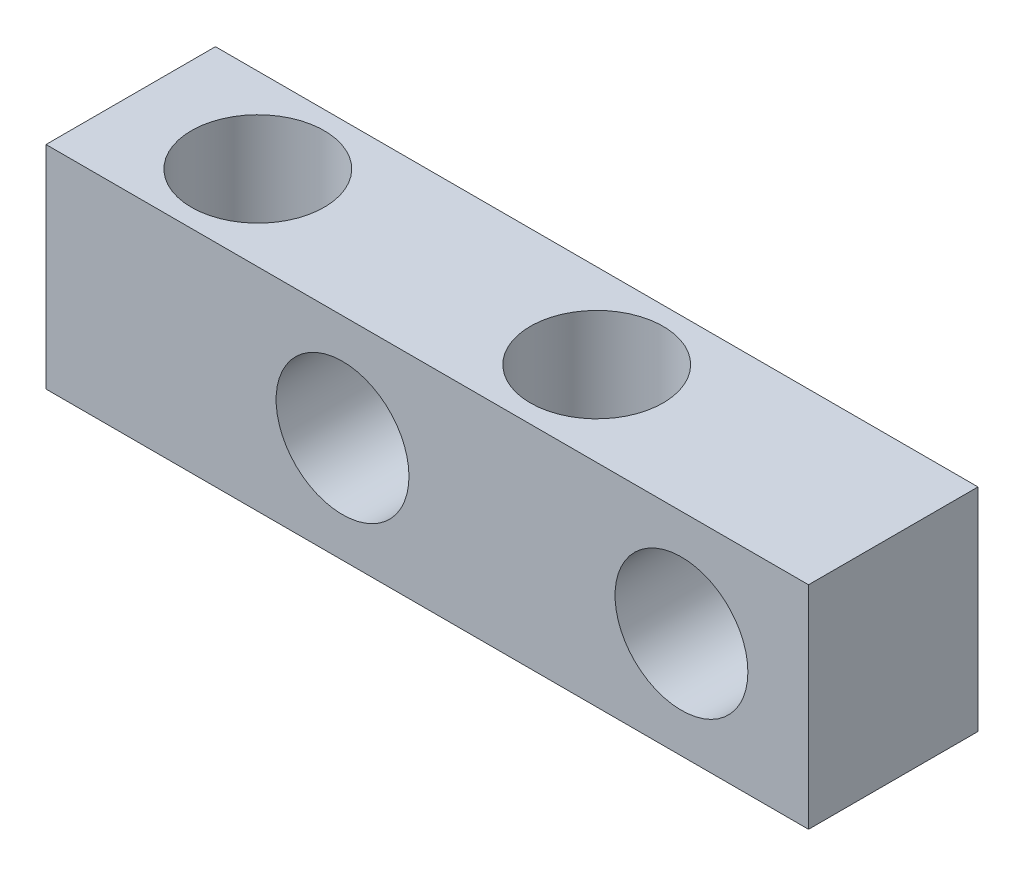
ISO-10303-21;
HEADER;
FILE_DESCRIPTION(('STEP AP214'),'2;1');
FILE_NAME('part.step','',(''),(''),'','','');
FILE_SCHEMA(('AUTOMOTIVE_DESIGN { 1 0 10303 214 1 1 1 1 }'));
ENDSEC;
DATA;
#1=APPLICATION_CONTEXT('core data for automotive mechanical design processes');
#2=APPLICATION_PROTOCOL_DEFINITION('international standard','automotive_design',2000,#1);
#3=PRODUCT_CONTEXT('',#1,'mechanical');
#4=PRODUCT('Part','Part','',(#3));
#5=PRODUCT_RELATED_PRODUCT_CATEGORY('part','',(#4));
#6=PRODUCT_DEFINITION_FORMATION('','',#4);
#7=PRODUCT_DEFINITION_CONTEXT('part definition',#1,'design');
#8=PRODUCT_DEFINITION('design','',#6,#7);
#9=PRODUCT_DEFINITION_SHAPE('','',#8);
#10=(LENGTH_UNIT() NAMED_UNIT(*) SI_UNIT(.MILLI.,.METRE.));
#11=(NAMED_UNIT(*) PLANE_ANGLE_UNIT() SI_UNIT($,.RADIAN.));
#12=(NAMED_UNIT(*) SI_UNIT($,.STERADIAN.) SOLID_ANGLE_UNIT());
#13=UNCERTAINTY_MEASURE_WITH_UNIT(LENGTH_MEASURE(1.E-05),#10,'distance_accuracy_value','');
#14=(GEOMETRIC_REPRESENTATION_CONTEXT(3) GLOBAL_UNCERTAINTY_ASSIGNED_CONTEXT((#13)) GLOBAL_UNIT_ASSIGNED_CONTEXT((#10,
#11,#12)) REPRESENTATION_CONTEXT('',''));
#15=CARTESIAN_POINT('',(0.,0.,0.));
#16=DIRECTION('',(0.,0.,1.));
#17=DIRECTION('',(1.,0.,0.));
#18=AXIS2_PLACEMENT_3D('',#15,#16,#17);
#19=CARTESIAN_POINT('',(0.,0.,3.175));
#20=DIRECTION('',(0.,0.,-1.));
#21=DIRECTION('',(-1.,0.,0.));
#22=AXIS2_PLACEMENT_3D('',#19,#20,#21);
#23=PLANE('',#22);
#24=DIRECTION('',(0.,1.,0.));
#25=VECTOR('',#24,1.);
#26=CARTESIAN_POINT('',(14.2875,-3.96875,3.175));
#27=LINE('',#26,#25);
#28=CARTESIAN_POINT('',(14.2875,-3.96875,3.175));
#29=VERTEX_POINT('',#28);
#30=CARTESIAN_POINT('',(14.2875,3.96875,3.175));
#31=VERTEX_POINT('',#30);
#32=EDGE_CURVE('E98',#29,#31,#27,.T.);
#33=ORIENTED_EDGE('',*,*,#32,.T.);
#34=DIRECTION('',(-1.,0.,0.));
#35=VECTOR('',#34,1.);
#36=CARTESIAN_POINT('',(-14.2875,3.96875,3.175));
#37=LINE('',#36,#35);
#38=CARTESIAN_POINT('',(-14.2875,3.96875,3.175));
#39=VERTEX_POINT('',#38);
#40=EDGE_CURVE('E93',#31,#39,#37,.T.);
#41=ORIENTED_EDGE('',*,*,#40,.T.);
#42=DIRECTION('',(0.,-1.,0.));
#43=VECTOR('',#42,1.);
#44=CARTESIAN_POINT('',(-14.2875,-3.96875,3.175));
#45=LINE('',#44,#43);
#46=CARTESIAN_POINT('',(-14.2875,-3.96875,3.175));
#47=VERTEX_POINT('',#46);
#48=EDGE_CURVE('E96',#39,#47,#45,.T.);
#49=ORIENTED_EDGE('',*,*,#48,.T.);
#50=DIRECTION('',(1.,0.,0.));
#51=VECTOR('',#50,1.);
#52=CARTESIAN_POINT('',(-14.2875,-3.96875,3.175));
#53=LINE('',#52,#51);
#54=EDGE_CURVE('E63',#47,#29,#53,.T.);
#55=ORIENTED_EDGE('',*,*,#54,.T.);
#56=EDGE_LOOP('',(#33,#41,#49,#55));
#57=FACE_BOUND('',#56,.T.);
#58=CARTESIAN_POINT('',(-3.17500000000001,0.,3.175));
#59=DIRECTION('',(0.,0.,1.));
#60=DIRECTION('',(1.,0.,0.));
#61=AXIS2_PLACEMENT_3D('',#58,#59,#60);
#62=CIRCLE('',#61,2.4892);
#63=CARTESIAN_POINT('',(-0.685800000000011,0.,3.175));
#64=VERTEX_POINT('',#63);
#65=EDGE_CURVE('E118',#64,#64,#62,.T.);
#66=ORIENTED_EDGE('',*,*,#65,.F.);
#67=EDGE_LOOP('',(#66));
#68=FACE_BOUND('',#67,.T.);
#69=CARTESIAN_POINT('',(9.52499999999999,0.,3.175));
#70=DIRECTION('',(0.,0.,1.));
#71=DIRECTION('',(1.,0.,0.));
#72=AXIS2_PLACEMENT_3D('',#69,#70,#71);
#73=CIRCLE('',#72,2.4892);
#74=CARTESIAN_POINT('',(12.0142,0.,3.175));
#75=VERTEX_POINT('',#74);
#76=EDGE_CURVE('E140',#75,#75,#73,.T.);
#77=ORIENTED_EDGE('',*,*,#76,.F.);
#78=EDGE_LOOP('',(#77));
#79=FACE_BOUND('',#78,.T.);
#80=ADVANCED_FACE('F45',(#57,#68,#79),#23,.F.);
#81=CARTESIAN_POINT('',(0.,0.,-3.175));
#82=DIRECTION('',(0.,0.,-1.));
#83=DIRECTION('',(-1.,0.,0.));
#84=AXIS2_PLACEMENT_3D('',#81,#82,#83);
#85=PLANE('',#84);
#86=CARTESIAN_POINT('',(-3.17500000000001,0.,-3.175));
#87=DIRECTION('',(0.,0.,1.));
#88=DIRECTION('',(1.,0.,0.));
#89=AXIS2_PLACEMENT_3D('',#86,#87,#88);
#90=CIRCLE('',#89,2.4892);
#91=CARTESIAN_POINT('',(-0.685800000000011,0.,-3.175));
#92=VERTEX_POINT('',#91);
#93=EDGE_CURVE('E136',#92,#92,#90,.T.);
#94=ORIENTED_EDGE('',*,*,#93,.T.);
#95=EDGE_LOOP('',(#94));
#96=FACE_BOUND('',#95,.T.);
#97=DIRECTION('',(0.,1.,0.));
#98=VECTOR('',#97,1.);
#99=CARTESIAN_POINT('',(14.2875,-3.96875,-3.175));
#100=LINE('',#99,#98);
#101=CARTESIAN_POINT('',(14.2875,-3.96875,-3.175));
#102=VERTEX_POINT('',#101);
#103=CARTESIAN_POINT('',(14.2875,3.96875,-3.175));
#104=VERTEX_POINT('',#103);
#105=EDGE_CURVE('E114',#102,#104,#100,.T.);
#106=ORIENTED_EDGE('',*,*,#105,.F.);
#107=DIRECTION('',(1.,0.,0.));
#108=VECTOR('',#107,1.);
#109=CARTESIAN_POINT('',(-14.2875,-3.96875,-3.175));
#110=LINE('',#109,#108);
#111=CARTESIAN_POINT('',(-14.2875,-3.96875,-3.175));
#112=VERTEX_POINT('',#111);
#113=EDGE_CURVE('E86',#112,#102,#110,.T.);
#114=ORIENTED_EDGE('',*,*,#113,.F.);
#115=DIRECTION('',(0.,-1.,0.));
#116=VECTOR('',#115,1.);
#117=CARTESIAN_POINT('',(-14.2875,-3.96875,-3.175));
#118=LINE('',#117,#116);
#119=CARTESIAN_POINT('',(-14.2875,3.96875,-3.175));
#120=VERTEX_POINT('',#119);
#121=EDGE_CURVE('E80',#120,#112,#118,.T.);
#122=ORIENTED_EDGE('',*,*,#121,.F.);
#123=DIRECTION('',(-1.,0.,0.));
#124=VECTOR('',#123,1.);
#125=CARTESIAN_POINT('',(-14.2875,3.96875,-3.175));
#126=LINE('',#125,#124);
#127=EDGE_CURVE('E103',#104,#120,#126,.T.);
#128=ORIENTED_EDGE('',*,*,#127,.F.);
#129=EDGE_LOOP('',(#106,#114,#122,#128));
#130=FACE_BOUND('',#129,.T.);
#131=CARTESIAN_POINT('',(9.52499999999999,0.,-3.175));
#132=DIRECTION('',(0.,0.,1.));
#133=DIRECTION('',(1.,0.,0.));
#134=AXIS2_PLACEMENT_3D('',#131,#132,#133);
#135=CIRCLE('',#134,2.4892);
#136=CARTESIAN_POINT('',(12.0142,0.,-3.175));
#137=VERTEX_POINT('',#136);
#138=EDGE_CURVE('E144',#137,#137,#135,.T.);
#139=ORIENTED_EDGE('',*,*,#138,.T.);
#140=EDGE_LOOP('',(#139));
#141=FACE_BOUND('',#140,.T.);
#142=ADVANCED_FACE('F131',(#96,#130,#141),#85,.T.);
#143=CARTESIAN_POINT('',(14.2875,-3.96875,3.175));
#144=DIRECTION('',(-1.,0.,0.));
#145=DIRECTION('',(0.,0.,1.));
#146=AXIS2_PLACEMENT_3D('',#143,#144,#145);
#147=PLANE('',#146);
#148=ORIENTED_EDGE('',*,*,#105,.T.);
#149=DIRECTION('',(0.,0.,-1.));
#150=VECTOR('',#149,1.);
#151=CARTESIAN_POINT('',(14.2875,3.96875,3.175));
#152=LINE('',#151,#150);
#153=EDGE_CURVE('E11',#31,#104,#152,.T.);
#154=ORIENTED_EDGE('',*,*,#153,.F.);
#155=ORIENTED_EDGE('',*,*,#32,.F.);
#156=DIRECTION('',(0.,0.,-1.));
#157=VECTOR('',#156,1.);
#158=CARTESIAN_POINT('',(14.2875,-3.96875,3.175));
#159=LINE('',#158,#157);
#160=EDGE_CURVE('E110',#29,#102,#159,.T.);
#161=ORIENTED_EDGE('',*,*,#160,.T.);
#162=EDGE_LOOP('',(#148,#154,#155,#161));
#163=FACE_BOUND('',#162,.T.);
#164=ADVANCED_FACE('F47',(#163),#147,.F.);
#165=CARTESIAN_POINT('',(-14.2875,3.96875,3.175));
#166=DIRECTION('',(0.,-1.,0.));
#167=DIRECTION('',(1.,0.,0.));
#168=AXIS2_PLACEMENT_3D('',#165,#166,#167);
#169=PLANE('',#168);
#170=CARTESIAN_POINT('',(3.17499999999999,3.96875,0.));
#171=DIRECTION('',(0.,1.,0.));
#172=DIRECTION('',(0.,0.,1.));
#173=AXIS2_PLACEMENT_3D('',#170,#171,#172);
#174=CIRCLE('',#173,2.4892);
#175=CARTESIAN_POINT('',(3.17499999999999,3.96875,2.4892));
#176=VERTEX_POINT('',#175);
#177=EDGE_CURVE('E156',#176,#176,#174,.T.);
#178=ORIENTED_EDGE('',*,*,#177,.F.);
#179=EDGE_LOOP('',(#178));
#180=FACE_BOUND('',#179,.T.);
#181=CARTESIAN_POINT('',(-9.52500000000001,3.96875,0.));
#182=DIRECTION('',(0.,1.,0.));
#183=DIRECTION('',(0.,0.,1.));
#184=AXIS2_PLACEMENT_3D('',#181,#182,#183);
#185=CIRCLE('',#184,2.4892);
#186=CARTESIAN_POINT('',(-9.52500000000001,3.96875,2.4892));
#187=VERTEX_POINT('',#186);
#188=EDGE_CURVE('E152',#187,#187,#185,.T.);
#189=ORIENTED_EDGE('',*,*,#188,.F.);
#190=EDGE_LOOP('',(#189));
#191=FACE_BOUND('',#190,.T.);
#192=ORIENTED_EDGE('',*,*,#127,.T.);
#193=DIRECTION('',(0.,0.,-1.));
#194=VECTOR('',#193,1.);
#195=CARTESIAN_POINT('',(-14.2875,3.96875,3.175));
#196=LINE('',#195,#194);
#197=EDGE_CURVE('E55',#39,#120,#196,.T.);
#198=ORIENTED_EDGE('',*,*,#197,.F.);
#199=ORIENTED_EDGE('',*,*,#40,.F.);
#200=ORIENTED_EDGE('',*,*,#153,.T.);
#201=EDGE_LOOP('',(#192,#198,#199,#200));
#202=FACE_BOUND('',#201,.T.);
#203=ADVANCED_FACE('F102',(#180,#191,#202),#169,.F.);
#204=CARTESIAN_POINT('',(-14.2875,-3.96875,3.175));
#205=DIRECTION('',(1.,0.,0.));
#206=DIRECTION('',(0.,1.,0.));
#207=AXIS2_PLACEMENT_3D('',#204,#205,#206);
#208=PLANE('',#207);
#209=ORIENTED_EDGE('',*,*,#121,.T.);
#210=DIRECTION('',(0.,0.,-1.));
#211=VECTOR('',#210,1.);
#212=CARTESIAN_POINT('',(-14.2875,-3.96875,3.175));
#213=LINE('',#212,#211);
#214=EDGE_CURVE('E105',#47,#112,#213,.T.);
#215=ORIENTED_EDGE('',*,*,#214,.F.);
#216=ORIENTED_EDGE('',*,*,#48,.F.);
#217=ORIENTED_EDGE('',*,*,#197,.T.);
#218=EDGE_LOOP('',(#209,#215,#216,#217));
#219=FACE_BOUND('',#218,.T.);
#220=ADVANCED_FACE('F106',(#219),#208,.F.);
#221=CARTESIAN_POINT('',(-14.2875,-3.96875,3.175));
#222=DIRECTION('',(0.,1.,0.));
#223=DIRECTION('',(-1.,0.,0.));
#224=AXIS2_PLACEMENT_3D('',#221,#222,#223);
#225=PLANE('',#224);
#226=CARTESIAN_POINT('',(3.17499999999999,-3.96875,0.));
#227=DIRECTION('',(0.,1.,0.));
#228=DIRECTION('',(0.,0.,1.));
#229=AXIS2_PLACEMENT_3D('',#226,#227,#228);
#230=CIRCLE('',#229,2.4892);
#231=CARTESIAN_POINT('',(3.17499999999999,-3.96875,2.4892));
#232=VERTEX_POINT('',#231);
#233=EDGE_CURVE('E148',#232,#232,#230,.T.);
#234=ORIENTED_EDGE('',*,*,#233,.T.);
#235=EDGE_LOOP('',(#234));
#236=FACE_BOUND('',#235,.T.);
#237=CARTESIAN_POINT('',(-9.52500000000001,-3.96875,0.));
#238=DIRECTION('',(0.,1.,0.));
#239=DIRECTION('',(0.,0.,1.));
#240=AXIS2_PLACEMENT_3D('',#237,#238,#239);
#241=CIRCLE('',#240,2.4892);
#242=CARTESIAN_POINT('',(-9.52500000000001,-3.96875,2.4892));
#243=VERTEX_POINT('',#242);
#244=EDGE_CURVE('E157',#243,#243,#241,.T.);
#245=ORIENTED_EDGE('',*,*,#244,.T.);
#246=EDGE_LOOP('',(#245));
#247=FACE_BOUND('',#246,.T.);
#248=ORIENTED_EDGE('',*,*,#113,.T.);
#249=ORIENTED_EDGE('',*,*,#160,.F.);
#250=ORIENTED_EDGE('',*,*,#54,.F.);
#251=ORIENTED_EDGE('',*,*,#214,.T.);
#252=EDGE_LOOP('',(#248,#249,#250,#251));
#253=FACE_BOUND('',#252,.T.);
#254=ADVANCED_FACE('F128',(#236,#247,#253),#225,.F.);
#255=CARTESIAN_POINT('',(-3.17500000000001,0.,3.175));
#256=DIRECTION('',(0.,0.,-1.));
#257=DIRECTION('',(-1.,0.,0.));
#258=AXIS2_PLACEMENT_3D('',#255,#256,#257);
#259=CYLINDRICAL_SURFACE('',#258,2.4892);
#260=ORIENTED_EDGE('',*,*,#65,.T.);
#261=EDGE_LOOP('',(#260));
#262=FACE_BOUND('',#261,.T.);
#263=ORIENTED_EDGE('',*,*,#93,.F.);
#264=EDGE_LOOP('',(#263));
#265=FACE_BOUND('',#264,.T.);
#266=ADVANCED_FACE('F186',(#262,#265),#259,.F.);
#267=CARTESIAN_POINT('',(9.52499999999999,0.,3.175));
#268=DIRECTION('',(0.,0.,-1.));
#269=DIRECTION('',(-1.,0.,0.));
#270=AXIS2_PLACEMENT_3D('',#267,#268,#269);
#271=CYLINDRICAL_SURFACE('',#270,2.4892);
#272=ORIENTED_EDGE('',*,*,#76,.T.);
#273=EDGE_LOOP('',(#272));
#274=FACE_BOUND('',#273,.T.);
#275=ORIENTED_EDGE('',*,*,#138,.F.);
#276=EDGE_LOOP('',(#275));
#277=FACE_BOUND('',#276,.T.);
#278=ADVANCED_FACE('F176',(#274,#277),#271,.F.);
#279=CARTESIAN_POINT('',(-9.52500000000001,-3.96875,0.));
#280=DIRECTION('',(0.,1.,0.));
#281=DIRECTION('',(0.,0.,1.));
#282=AXIS2_PLACEMENT_3D('',#279,#280,#281);
#283=CYLINDRICAL_SURFACE('',#282,2.4892);
#284=ORIENTED_EDGE('',*,*,#244,.F.);
#285=EDGE_LOOP('',(#284));
#286=FACE_BOUND('',#285,.T.);
#287=ORIENTED_EDGE('',*,*,#188,.T.);
#288=EDGE_LOOP('',(#287));
#289=FACE_BOUND('',#288,.T.);
#290=ADVANCED_FACE('F174',(#286,#289),#283,.F.);
#291=CARTESIAN_POINT('',(3.17499999999999,-3.96875,0.));
#292=DIRECTION('',(0.,1.,0.));
#293=DIRECTION('',(0.,0.,1.));
#294=AXIS2_PLACEMENT_3D('',#291,#292,#293);
#295=CYLINDRICAL_SURFACE('',#294,2.4892);
#296=ORIENTED_EDGE('',*,*,#233,.F.);
#297=EDGE_LOOP('',(#296));
#298=FACE_BOUND('',#297,.T.);
#299=ORIENTED_EDGE('',*,*,#177,.T.);
#300=EDGE_LOOP('',(#299));
#301=FACE_BOUND('',#300,.T.);
#302=ADVANCED_FACE('F168',(#298,#301),#295,.F.);
#303=CLOSED_SHELL('',(#80,#142,#164,#203,#220,#254,#266,#278,#290,#302));
#304=MANIFOLD_SOLID_BREP('B2',#303);
#305=ADVANCED_BREP_SHAPE_REPRESENTATION('',(#18,#304),#14);
#306=SHAPE_DEFINITION_REPRESENTATION(#9,#305);
ENDSEC;
END-ISO-10303-21;
